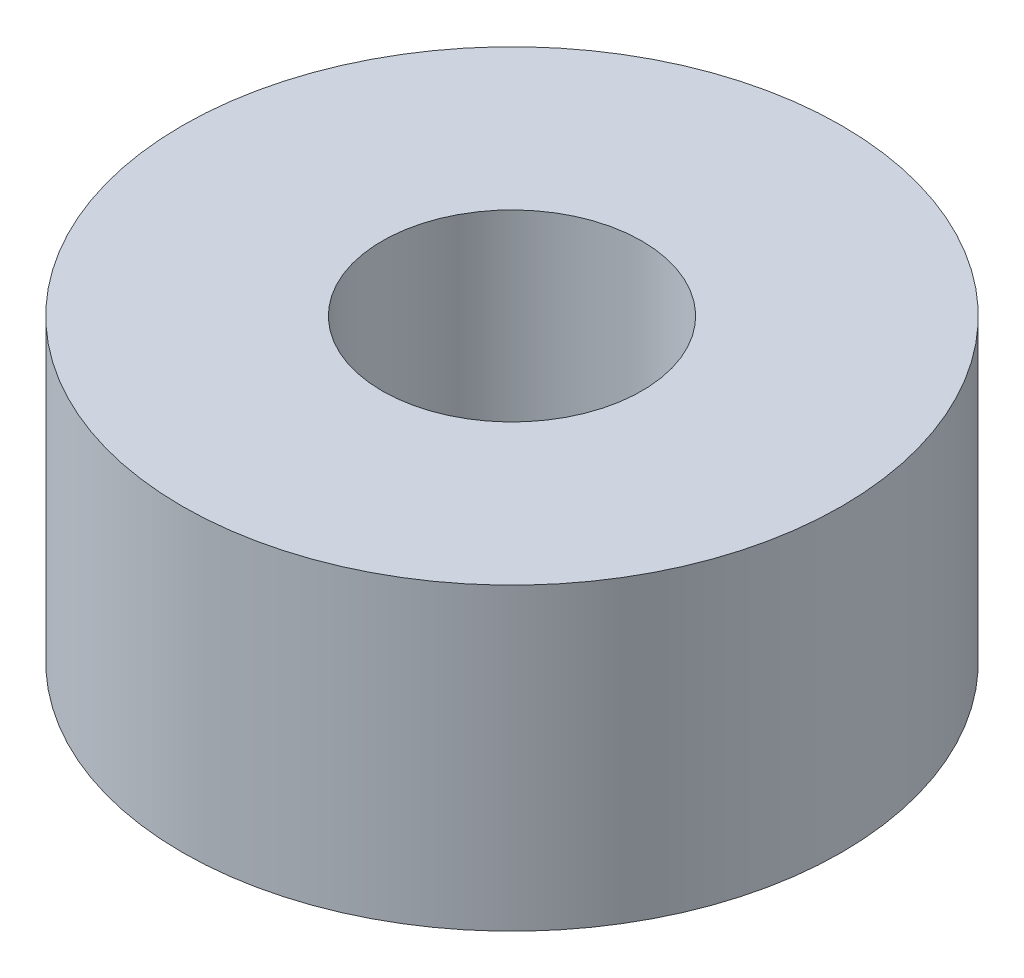
ISO-10303-21;
HEADER;
FILE_DESCRIPTION(('STEP AP214'),'2;1');
FILE_NAME('part.step','',(''),(''),'','','');
FILE_SCHEMA(('AUTOMOTIVE_DESIGN { 1 0 10303 214 1 1 1 1 }'));
ENDSEC;
DATA;
#1=APPLICATION_CONTEXT('core data for automotive mechanical design processes');
#2=APPLICATION_PROTOCOL_DEFINITION('international standard','automotive_design',2000,#1);
#3=PRODUCT_CONTEXT('',#1,'mechanical');
#4=PRODUCT('Part','Part','',(#3));
#5=PRODUCT_RELATED_PRODUCT_CATEGORY('part','',(#4));
#6=PRODUCT_DEFINITION_FORMATION('','',#4);
#7=PRODUCT_DEFINITION_CONTEXT('part definition',#1,'design');
#8=PRODUCT_DEFINITION('design','',#6,#7);
#9=PRODUCT_DEFINITION_SHAPE('','',#8);
#10=(LENGTH_UNIT() NAMED_UNIT(*) SI_UNIT(.MILLI.,.METRE.));
#11=(NAMED_UNIT(*) PLANE_ANGLE_UNIT() SI_UNIT($,.RADIAN.));
#12=(NAMED_UNIT(*) SI_UNIT($,.STERADIAN.) SOLID_ANGLE_UNIT());
#13=UNCERTAINTY_MEASURE_WITH_UNIT(LENGTH_MEASURE(1.E-05),#10,'distance_accuracy_value','');
#14=(GEOMETRIC_REPRESENTATION_CONTEXT(3) GLOBAL_UNCERTAINTY_ASSIGNED_CONTEXT((#13)) GLOBAL_UNIT_ASSIGNED_CONTEXT((#10,
#11,#12)) REPRESENTATION_CONTEXT('',''));
#15=CARTESIAN_POINT('',(0.,0.,0.));
#16=DIRECTION('',(0.,0.,1.));
#17=DIRECTION('',(1.,0.,0.));
#18=AXIS2_PLACEMENT_3D('',#15,#16,#17);
#19=CARTESIAN_POINT('',(0.,3.,0.));
#20=DIRECTION('',(0.,1.,0.));
#21=DIRECTION('',(0.,0.,1.));
#22=AXIS2_PLACEMENT_3D('',#19,#20,#21);
#23=PLANE('',#22);
#24=CARTESIAN_POINT('',(0.,3.,0.));
#25=DIRECTION('',(0.,1.,0.));
#26=DIRECTION('',(0.,0.,1.));
#27=AXIS2_PLACEMENT_3D('',#24,#25,#26);
#28=CIRCLE('',#27,3.3);
#29=CARTESIAN_POINT('',(0.,3.,3.3));
#30=VERTEX_POINT('',#29);
#31=EDGE_CURVE('E10',#30,#30,#28,.T.);
#32=ORIENTED_EDGE('',*,*,#31,.T.);
#33=EDGE_LOOP('',(#32));
#34=FACE_BOUND('',#33,.T.);
#35=CARTESIAN_POINT('',(0.,3.,0.));
#36=DIRECTION('',(0.,1.,0.));
#37=DIRECTION('',(0.,0.,1.));
#38=AXIS2_PLACEMENT_3D('',#35,#36,#37);
#39=CIRCLE('',#38,1.3);
#40=CARTESIAN_POINT('',(0.,3.,1.3));
#41=VERTEX_POINT('',#40);
#42=EDGE_CURVE('E42',#41,#41,#39,.T.);
#43=ORIENTED_EDGE('',*,*,#42,.F.);
#44=EDGE_LOOP('',(#43));
#45=FACE_BOUND('',#44,.T.);
#46=ADVANCED_FACE('F31',(#34,#45),#23,.T.);
#47=CARTESIAN_POINT('',(0.,0.,0.));
#48=DIRECTION('',(0.,1.,0.));
#49=DIRECTION('',(0.,0.,1.));
#50=AXIS2_PLACEMENT_3D('',#47,#48,#49);
#51=PLANE('',#50);
#52=CARTESIAN_POINT('',(0.,0.,0.));
#53=DIRECTION('',(0.,1.,0.));
#54=DIRECTION('',(0.,0.,1.));
#55=AXIS2_PLACEMENT_3D('',#52,#53,#54);
#56=CIRCLE('',#55,3.3);
#57=CARTESIAN_POINT('',(0.,0.,3.3));
#58=VERTEX_POINT('',#57);
#59=EDGE_CURVE('E35',#58,#58,#56,.T.);
#60=ORIENTED_EDGE('',*,*,#59,.F.);
#61=EDGE_LOOP('',(#60));
#62=FACE_BOUND('',#61,.T.);
#63=CARTESIAN_POINT('',(0.,0.,0.));
#64=DIRECTION('',(0.,1.,0.));
#65=DIRECTION('',(0.,0.,1.));
#66=AXIS2_PLACEMENT_3D('',#63,#64,#65);
#67=CIRCLE('',#66,1.3);
#68=CARTESIAN_POINT('',(0.,0.,1.3));
#69=VERTEX_POINT('',#68);
#70=EDGE_CURVE('E44',#69,#69,#67,.T.);
#71=ORIENTED_EDGE('',*,*,#70,.T.);
#72=EDGE_LOOP('',(#71));
#73=FACE_BOUND('',#72,.T.);
#74=ADVANCED_FACE('F54',(#62,#73),#51,.F.);
#75=CARTESIAN_POINT('',(0.,3.,0.));
#76=DIRECTION('',(0.,-1.,0.));
#77=DIRECTION('',(0.,0.,-1.));
#78=AXIS2_PLACEMENT_3D('',#75,#76,#77);
#79=CYLINDRICAL_SURFACE('',#78,3.3);
#80=ORIENTED_EDGE('',*,*,#31,.F.);
#81=EDGE_LOOP('',(#80));
#82=FACE_BOUND('',#81,.T.);
#83=ORIENTED_EDGE('',*,*,#59,.T.);
#84=EDGE_LOOP('',(#83));
#85=FACE_BOUND('',#84,.T.);
#86=ADVANCED_FACE('F33',(#82,#85),#79,.T.);
#87=CARTESIAN_POINT('',(0.,3.,0.));
#88=DIRECTION('',(0.,-1.,0.));
#89=DIRECTION('',(0.,0.,-1.));
#90=AXIS2_PLACEMENT_3D('',#87,#88,#89);
#91=CYLINDRICAL_SURFACE('',#90,1.3);
#92=ORIENTED_EDGE('',*,*,#42,.T.);
#93=EDGE_LOOP('',(#92));
#94=FACE_BOUND('',#93,.T.);
#95=ORIENTED_EDGE('',*,*,#70,.F.);
#96=EDGE_LOOP('',(#95));
#97=FACE_BOUND('',#96,.T.);
#98=ADVANCED_FACE('F50',(#94,#97),#91,.F.);
#99=CLOSED_SHELL('',(#46,#74,#86,#98));
#100=MANIFOLD_SOLID_BREP('B2',#99);
#101=ADVANCED_BREP_SHAPE_REPRESENTATION('',(#18,#100),#14);
#102=SHAPE_DEFINITION_REPRESENTATION(#9,#101);
ENDSEC;
END-ISO-10303-21;
